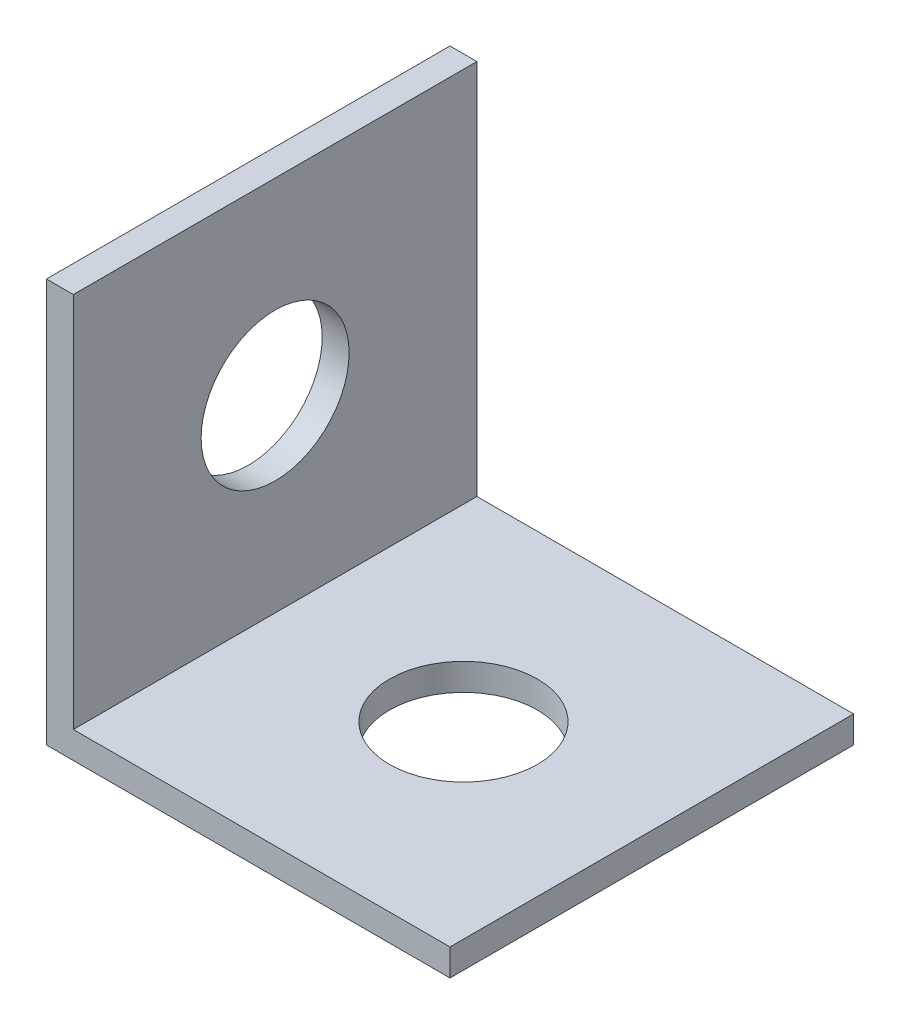
ISO-10303-21;
HEADER;
FILE_DESCRIPTION(('STEP AP214'),'2;1');
FILE_NAME('part.step','',(''),(''),'','','');
FILE_SCHEMA(('AUTOMOTIVE_DESIGN { 1 0 10303 214 1 1 1 1 }'));
ENDSEC;
DATA;
#1=APPLICATION_CONTEXT('core data for automotive mechanical design processes');
#2=APPLICATION_PROTOCOL_DEFINITION('international standard','automotive_design',2000,#1);
#3=PRODUCT_CONTEXT('',#1,'mechanical');
#4=PRODUCT('Part','Part','',(#3));
#5=PRODUCT_RELATED_PRODUCT_CATEGORY('part','',(#4));
#6=PRODUCT_DEFINITION_FORMATION('','',#4);
#7=PRODUCT_DEFINITION_CONTEXT('part definition',#1,'design');
#8=PRODUCT_DEFINITION('design','',#6,#7);
#9=PRODUCT_DEFINITION_SHAPE('','',#8);
#10=(LENGTH_UNIT() NAMED_UNIT(*) SI_UNIT(.MILLI.,.METRE.));
#11=(NAMED_UNIT(*) PLANE_ANGLE_UNIT() SI_UNIT($,.RADIAN.));
#12=(NAMED_UNIT(*) SI_UNIT($,.STERADIAN.) SOLID_ANGLE_UNIT());
#13=UNCERTAINTY_MEASURE_WITH_UNIT(LENGTH_MEASURE(1.E-05),#10,'distance_accuracy_value','');
#14=(GEOMETRIC_REPRESENTATION_CONTEXT(3) GLOBAL_UNCERTAINTY_ASSIGNED_CONTEXT((#13)) GLOBAL_UNIT_ASSIGNED_CONTEXT((#10,
#11,#12)) REPRESENTATION_CONTEXT('',''));
#15=CARTESIAN_POINT('',(0.,0.,0.));
#16=DIRECTION('',(0.,0.,1.));
#17=DIRECTION('',(1.,0.,0.));
#18=AXIS2_PLACEMENT_3D('',#15,#16,#17);
#19=CARTESIAN_POINT('',(15.,0.,15.));
#20=DIRECTION('',(0.,1.,0.));
#21=DIRECTION('',(-1.,0.,0.));
#22=AXIS2_PLACEMENT_3D('',#19,#20,#21);
#23=PLANE('',#22);
#24=CARTESIAN_POINT('',(8.,0.,7.5));
#25=DIRECTION('',(0.,-1.,0.));
#26=DIRECTION('',(1.,0.,0.));
#27=AXIS2_PLACEMENT_3D('',#24,#25,#26);
#28=CIRCLE('',#27,2.75);
#29=CARTESIAN_POINT('',(10.75,0.,7.5));
#30=VERTEX_POINT('',#29);
#31=EDGE_CURVE('E162',#30,#30,#28,.T.);
#32=ORIENTED_EDGE('',*,*,#31,.F.);
#33=EDGE_LOOP('',(#32));
#34=FACE_BOUND('',#33,.T.);
#35=DIRECTION('',(1.,0.,0.));
#36=VECTOR('',#35,1.);
#37=CARTESIAN_POINT('',(15.,0.,0.));
#38=LINE('',#37,#36);
#39=CARTESIAN_POINT('',(0.,0.,0.));
#40=VERTEX_POINT('',#39);
#41=CARTESIAN_POINT('',(15.,0.,0.));
#42=VERTEX_POINT('',#41);
#43=EDGE_CURVE('E118',#40,#42,#38,.T.);
#44=ORIENTED_EDGE('',*,*,#43,.T.);
#45=DIRECTION('',(0.,0.,-1.));
#46=VECTOR('',#45,1.);
#47=CARTESIAN_POINT('',(15.,0.,15.));
#48=LINE('',#47,#46);
#49=CARTESIAN_POINT('',(15.,0.,15.));
#50=VERTEX_POINT('',#49);
#51=EDGE_CURVE('E11',#50,#42,#48,.T.);
#52=ORIENTED_EDGE('',*,*,#51,.F.);
#53=DIRECTION('',(1.,0.,0.));
#54=VECTOR('',#53,1.);
#55=CARTESIAN_POINT('',(15.,0.,15.));
#56=LINE('',#55,#54);
#57=CARTESIAN_POINT('',(0.,0.,15.));
#58=VERTEX_POINT('',#57);
#59=EDGE_CURVE('E128',#58,#50,#56,.T.);
#60=ORIENTED_EDGE('',*,*,#59,.F.);
#61=DIRECTION('',(0.,0.,-1.));
#62=VECTOR('',#61,1.);
#63=CARTESIAN_POINT('',(0.,0.,15.));
#64=LINE('',#63,#62);
#65=EDGE_CURVE('E114',#58,#40,#64,.T.);
#66=ORIENTED_EDGE('',*,*,#65,.T.);
#67=EDGE_LOOP('',(#44,#52,#60,#66));
#68=FACE_BOUND('',#67,.T.);
#69=ADVANCED_FACE('F33',(#34,#68),#23,.F.);
#70=CARTESIAN_POINT('',(15.,1.,15.));
#71=DIRECTION('',(-1.,0.,0.));
#72=DIRECTION('',(0.,0.,1.));
#73=AXIS2_PLACEMENT_3D('',#70,#71,#72);
#74=PLANE('',#73);
#75=DIRECTION('',(0.,1.,0.));
#76=VECTOR('',#75,1.);
#77=CARTESIAN_POINT('',(15.,1.,0.));
#78=LINE('',#77,#76);
#79=CARTESIAN_POINT('',(15.,1.,0.));
#80=VERTEX_POINT('',#79);
#81=EDGE_CURVE('E121',#42,#80,#78,.T.);
#82=ORIENTED_EDGE('',*,*,#81,.T.);
#83=DIRECTION('',(0.,0.,-1.));
#84=VECTOR('',#83,1.);
#85=CARTESIAN_POINT('',(15.,1.,15.));
#86=LINE('',#85,#84);
#87=CARTESIAN_POINT('',(15.,1.,15.));
#88=VERTEX_POINT('',#87);
#89=EDGE_CURVE('E42',#88,#80,#86,.T.);
#90=ORIENTED_EDGE('',*,*,#89,.F.);
#91=DIRECTION('',(0.,1.,0.));
#92=VECTOR('',#91,1.);
#93=CARTESIAN_POINT('',(15.,1.,15.));
#94=LINE('',#93,#92);
#95=EDGE_CURVE('E87',#50,#88,#94,.T.);
#96=ORIENTED_EDGE('',*,*,#95,.F.);
#97=ORIENTED_EDGE('',*,*,#51,.T.);
#98=EDGE_LOOP('',(#82,#90,#96,#97));
#99=FACE_BOUND('',#98,.T.);
#100=ADVANCED_FACE('F155',(#99),#74,.F.);
#101=CARTESIAN_POINT('',(1.,1.,15.));
#102=DIRECTION('',(0.,-1.,0.));
#103=DIRECTION('',(1.,0.,0.));
#104=AXIS2_PLACEMENT_3D('',#101,#102,#103);
#105=PLANE('',#104);
#106=CARTESIAN_POINT('',(8.,1.,7.5));
#107=DIRECTION('',(0.,-1.,0.));
#108=DIRECTION('',(1.,0.,0.));
#109=AXIS2_PLACEMENT_3D('',#106,#107,#108);
#110=CIRCLE('',#109,2.75);
#111=CARTESIAN_POINT('',(10.75,1.,7.5));
#112=VERTEX_POINT('',#111);
#113=EDGE_CURVE('E36',#112,#112,#110,.T.);
#114=ORIENTED_EDGE('',*,*,#113,.T.);
#115=EDGE_LOOP('',(#114));
#116=FACE_BOUND('',#115,.T.);
#117=DIRECTION('',(-1.,0.,0.));
#118=VECTOR('',#117,1.);
#119=CARTESIAN_POINT('',(1.,1.,0.));
#120=LINE('',#119,#118);
#121=CARTESIAN_POINT('',(1.,1.,0.));
#122=VERTEX_POINT('',#121);
#123=EDGE_CURVE('E123',#80,#122,#120,.T.);
#124=ORIENTED_EDGE('',*,*,#123,.T.);
#125=DIRECTION('',(0.,0.,-1.));
#126=VECTOR('',#125,1.);
#127=CARTESIAN_POINT('',(1.,1.,15.));
#128=LINE('',#127,#126);
#129=CARTESIAN_POINT('',(1.,1.,15.));
#130=VERTEX_POINT('',#129);
#131=EDGE_CURVE('E109',#130,#122,#128,.T.);
#132=ORIENTED_EDGE('',*,*,#131,.F.);
#133=DIRECTION('',(-1.,0.,0.));
#134=VECTOR('',#133,1.);
#135=CARTESIAN_POINT('',(1.,1.,15.));
#136=LINE('',#135,#134);
#137=EDGE_CURVE('E100',#88,#130,#136,.T.);
#138=ORIENTED_EDGE('',*,*,#137,.F.);
#139=ORIENTED_EDGE('',*,*,#89,.T.);
#140=EDGE_LOOP('',(#124,#132,#138,#139));
#141=FACE_BOUND('',#140,.T.);
#142=ADVANCED_FACE('F135',(#116,#141),#105,.F.);
#143=CARTESIAN_POINT('',(0.999999999999997,15.,15.));
#144=DIRECTION('',(-1.,0.,0.));
#145=DIRECTION('',(0.,-1.,0.));
#146=AXIS2_PLACEMENT_3D('',#143,#144,#145);
#147=PLANE('',#146);
#148=CARTESIAN_POINT('',(0.999999999999999,8.,7.5));
#149=DIRECTION('',(1.,0.,0.));
#150=DIRECTION('',(0.,1.,0.));
#151=AXIS2_PLACEMENT_3D('',#148,#149,#150);
#152=CIRCLE('',#151,2.75);
#153=CARTESIAN_POINT('',(0.999999999999998,10.75,7.5));
#154=VERTEX_POINT('',#153);
#155=EDGE_CURVE('E167',#154,#154,#152,.T.);
#156=ORIENTED_EDGE('',*,*,#155,.F.);
#157=EDGE_LOOP('',(#156));
#158=FACE_BOUND('',#157,.T.);
#159=DIRECTION('',(0.,1.,0.));
#160=VECTOR('',#159,1.);
#161=CARTESIAN_POINT('',(0.999999999999997,15.,0.));
#162=LINE('',#161,#160);
#163=CARTESIAN_POINT('',(0.999999999999997,15.,0.));
#164=VERTEX_POINT('',#163);
#165=EDGE_CURVE('E108',#122,#164,#162,.T.);
#166=ORIENTED_EDGE('',*,*,#165,.T.);
#167=DIRECTION('',(0.,0.,-1.));
#168=VECTOR('',#167,1.);
#169=CARTESIAN_POINT('',(0.999999999999997,15.,15.));
#170=LINE('',#169,#168);
#171=CARTESIAN_POINT('',(0.999999999999997,15.,15.));
#172=VERTEX_POINT('',#171);
#173=EDGE_CURVE('E105',#172,#164,#170,.T.);
#174=ORIENTED_EDGE('',*,*,#173,.F.);
#175=DIRECTION('',(0.,1.,0.));
#176=VECTOR('',#175,1.);
#177=CARTESIAN_POINT('',(0.999999999999997,15.,15.));
#178=LINE('',#177,#176);
#179=EDGE_CURVE('E94',#130,#172,#178,.T.);
#180=ORIENTED_EDGE('',*,*,#179,.F.);
#181=ORIENTED_EDGE('',*,*,#131,.T.);
#182=EDGE_LOOP('',(#166,#174,#180,#181));
#183=FACE_BOUND('',#182,.T.);
#184=ADVANCED_FACE('F106',(#158,#183),#147,.F.);
#185=CARTESIAN_POINT('',(0.,15.,15.));
#186=DIRECTION('',(0.,-1.,0.));
#187=DIRECTION('',(0.,0.,-1.));
#188=AXIS2_PLACEMENT_3D('',#185,#186,#187);
#189=PLANE('',#188);
#190=DIRECTION('',(-1.,0.,0.));
#191=VECTOR('',#190,1.);
#192=CARTESIAN_POINT('',(0.,15.,0.));
#193=LINE('',#192,#191);
#194=CARTESIAN_POINT('',(0.,15.,0.));
#195=VERTEX_POINT('',#194);
#196=EDGE_CURVE('E73',#164,#195,#193,.T.);
#197=ORIENTED_EDGE('',*,*,#196,.T.);
#198=DIRECTION('',(0.,0.,-1.));
#199=VECTOR('',#198,1.);
#200=CARTESIAN_POINT('',(0.,15.,15.));
#201=LINE('',#200,#199);
#202=CARTESIAN_POINT('',(0.,15.,15.));
#203=VERTEX_POINT('',#202);
#204=EDGE_CURVE('E110',#203,#195,#201,.T.);
#205=ORIENTED_EDGE('',*,*,#204,.F.);
#206=DIRECTION('',(-1.,0.,0.));
#207=VECTOR('',#206,1.);
#208=CARTESIAN_POINT('',(0.,15.,15.));
#209=LINE('',#208,#207);
#210=EDGE_CURVE('E98',#172,#203,#209,.T.);
#211=ORIENTED_EDGE('',*,*,#210,.F.);
#212=ORIENTED_EDGE('',*,*,#173,.T.);
#213=EDGE_LOOP('',(#197,#205,#211,#212));
#214=FACE_BOUND('',#213,.T.);
#215=ADVANCED_FACE('F112',(#214),#189,.F.);
#216=CARTESIAN_POINT('',(0.,0.,15.));
#217=DIRECTION('',(1.,0.,0.));
#218=DIRECTION('',(0.,1.,0.));
#219=AXIS2_PLACEMENT_3D('',#216,#217,#218);
#220=PLANE('',#219);
#221=CARTESIAN_POINT('',(0.,8.,7.5));
#222=DIRECTION('',(1.,0.,0.));
#223=DIRECTION('',(0.,1.,0.));
#224=AXIS2_PLACEMENT_3D('',#221,#222,#223);
#225=CIRCLE('',#224,2.75);
#226=CARTESIAN_POINT('',(0.,10.75,7.5));
#227=VERTEX_POINT('',#226);
#228=EDGE_CURVE('E164',#227,#227,#225,.T.);
#229=ORIENTED_EDGE('',*,*,#228,.T.);
#230=EDGE_LOOP('',(#229));
#231=FACE_BOUND('',#230,.T.);
#232=DIRECTION('',(0.,-1.,0.));
#233=VECTOR('',#232,1.);
#234=CARTESIAN_POINT('',(0.,0.,0.));
#235=LINE('',#234,#233);
#236=EDGE_CURVE('E79',#195,#40,#235,.T.);
#237=ORIENTED_EDGE('',*,*,#236,.T.);
#238=ORIENTED_EDGE('',*,*,#65,.F.);
#239=DIRECTION('',(0.,-1.,0.));
#240=VECTOR('',#239,1.);
#241=CARTESIAN_POINT('',(0.,0.,15.));
#242=LINE('',#241,#240);
#243=EDGE_CURVE('E50',#203,#58,#242,.T.);
#244=ORIENTED_EDGE('',*,*,#243,.F.);
#245=ORIENTED_EDGE('',*,*,#204,.T.);
#246=EDGE_LOOP('',(#237,#238,#244,#245));
#247=FACE_BOUND('',#246,.T.);
#248=ADVANCED_FACE('F142',(#231,#247),#220,.F.);
#249=CARTESIAN_POINT('',(0.,0.,15.));
#250=DIRECTION('',(0.,0.,-1.));
#251=DIRECTION('',(-1.,0.,0.));
#252=AXIS2_PLACEMENT_3D('',#249,#250,#251);
#253=PLANE('',#252);
#254=ORIENTED_EDGE('',*,*,#59,.T.);
#255=ORIENTED_EDGE('',*,*,#95,.T.);
#256=ORIENTED_EDGE('',*,*,#137,.T.);
#257=ORIENTED_EDGE('',*,*,#179,.T.);
#258=ORIENTED_EDGE('',*,*,#210,.T.);
#259=ORIENTED_EDGE('',*,*,#243,.T.);
#260=EDGE_LOOP('',(#254,#255,#256,#257,#258,#259));
#261=FACE_BOUND('',#260,.T.);
#262=ADVANCED_FACE('F96',(#261),#253,.F.);
#263=CARTESIAN_POINT('',(0.,0.,0.));
#264=DIRECTION('',(0.,0.,-1.));
#265=DIRECTION('',(-1.,0.,0.));
#266=AXIS2_PLACEMENT_3D('',#263,#264,#265);
#267=PLANE('',#266);
#268=ORIENTED_EDGE('',*,*,#43,.F.);
#269=ORIENTED_EDGE('',*,*,#236,.F.);
#270=ORIENTED_EDGE('',*,*,#196,.F.);
#271=ORIENTED_EDGE('',*,*,#165,.F.);
#272=ORIENTED_EDGE('',*,*,#123,.F.);
#273=ORIENTED_EDGE('',*,*,#81,.F.);
#274=EDGE_LOOP('',(#268,#269,#270,#271,#272,#273));
#275=FACE_BOUND('',#274,.T.);
#276=ADVANCED_FACE('F138',(#275),#267,.T.);
#277=CARTESIAN_POINT('',(8.,19.05,7.5));
#278=DIRECTION('',(0.,-1.,0.));
#279=DIRECTION('',(1.,0.,0.));
#280=AXIS2_PLACEMENT_3D('',#277,#278,#279);
#281=CYLINDRICAL_SURFACE('',#280,2.75);
#282=CARTESIAN_POINT('',(10.75,0.,7.5));
#283=CARTESIAN_POINT('',(10.75,0.0104166666666667,7.5));
#284=CARTESIAN_POINT('',(10.75,0.0208333333333333,7.5));
#285=CARTESIAN_POINT('',(10.75,0.0416666666666667,7.5));
#286=CARTESIAN_POINT('',(10.75,0.0520833333333334,7.5));
#287=CARTESIAN_POINT('',(10.75,0.0729166666666667,7.5));
#288=CARTESIAN_POINT('',(10.75,0.0833333333333334,7.5));
#289=CARTESIAN_POINT('',(10.75,0.104166666666667,7.5));
#290=CARTESIAN_POINT('',(10.75,0.114583333333333,7.5));
#291=CARTESIAN_POINT('',(10.75,0.135416666666667,7.5));
#292=CARTESIAN_POINT('',(10.75,0.145833333333333,7.5));
#293=CARTESIAN_POINT('',(10.75,0.166666666666667,7.5));
#294=CARTESIAN_POINT('',(10.75,0.177083333333333,7.5));
#295=CARTESIAN_POINT('',(10.75,0.197916666666667,7.5));
#296=CARTESIAN_POINT('',(10.75,0.208333333333334,7.5));
#297=CARTESIAN_POINT('',(10.75,0.229166666666667,7.5));
#298=CARTESIAN_POINT('',(10.75,0.239583333333334,7.5));
#299=CARTESIAN_POINT('',(10.75,0.260416666666667,7.5));
#300=CARTESIAN_POINT('',(10.75,0.270833333333334,7.5));
#301=CARTESIAN_POINT('',(10.75,0.291666666666667,7.5));
#302=CARTESIAN_POINT('',(10.75,0.302083333333334,7.5));
#303=CARTESIAN_POINT('',(10.75,0.322916666666667,7.5));
#304=CARTESIAN_POINT('',(10.75,0.333333333333334,7.5));
#305=CARTESIAN_POINT('',(10.75,0.354166666666667,7.5));
#306=CARTESIAN_POINT('',(10.75,0.364583333333334,7.5));
#307=CARTESIAN_POINT('',(10.75,0.385416666666667,7.5));
#308=CARTESIAN_POINT('',(10.75,0.395833333333334,7.5));
#309=CARTESIAN_POINT('',(10.75,0.416666666666667,7.5));
#310=CARTESIAN_POINT('',(10.75,0.427083333333334,7.5));
#311=CARTESIAN_POINT('',(10.75,0.447916666666667,7.5));
#312=CARTESIAN_POINT('',(10.75,0.458333333333334,7.5));
#313=CARTESIAN_POINT('',(10.75,0.479166666666667,7.5));
#314=CARTESIAN_POINT('',(10.75,0.489583333333334,7.5));
#315=CARTESIAN_POINT('',(10.75,0.510416666666667,7.5));
#316=CARTESIAN_POINT('',(10.75,0.520833333333334,7.5));
#317=CARTESIAN_POINT('',(10.75,0.541666666666667,7.5));
#318=CARTESIAN_POINT('',(10.75,0.552083333333334,7.5));
#319=CARTESIAN_POINT('',(10.75,0.572916666666667,7.5));
#320=CARTESIAN_POINT('',(10.75,0.583333333333334,7.5));
#321=CARTESIAN_POINT('',(10.75,0.604166666666667,7.5));
#322=CARTESIAN_POINT('',(10.75,0.614583333333334,7.5));
#323=CARTESIAN_POINT('',(10.75,0.635416666666667,7.5));
#324=CARTESIAN_POINT('',(10.75,0.645833333333334,7.5));
#325=CARTESIAN_POINT('',(10.75,0.666666666666667,7.5));
#326=CARTESIAN_POINT('',(10.75,0.677083333333334,7.5));
#327=CARTESIAN_POINT('',(10.75,0.697916666666667,7.5));
#328=CARTESIAN_POINT('',(10.75,0.708333333333334,7.5));
#329=CARTESIAN_POINT('',(10.75,0.729166666666667,7.5));
#330=CARTESIAN_POINT('',(10.75,0.739583333333334,7.5));
#331=CARTESIAN_POINT('',(10.75,0.760416666666667,7.5));
#332=CARTESIAN_POINT('',(10.75,0.770833333333334,7.5));
#333=CARTESIAN_POINT('',(10.75,0.791666666666667,7.5));
#334=CARTESIAN_POINT('',(10.75,0.802083333333334,7.5));
#335=CARTESIAN_POINT('',(10.75,0.822916666666667,7.5));
#336=CARTESIAN_POINT('',(10.75,0.833333333333334,7.5));
#337=CARTESIAN_POINT('',(10.75,0.854166666666667,7.5));
#338=CARTESIAN_POINT('',(10.75,0.864583333333334,7.5));
#339=CARTESIAN_POINT('',(10.75,0.885416666666668,7.5));
#340=CARTESIAN_POINT('',(10.75,0.895833333333334,7.5));
#341=CARTESIAN_POINT('',(10.75,0.916666666666668,7.5));
#342=CARTESIAN_POINT('',(10.75,0.927083333333334,7.5));
#343=CARTESIAN_POINT('',(10.75,0.947916666666668,7.5));
#344=CARTESIAN_POINT('',(10.75,0.958333333333334,7.5));
#345=CARTESIAN_POINT('',(10.75,0.979166666666668,7.5));
#346=CARTESIAN_POINT('',(10.75,0.989583333333334,7.5));
#347=CARTESIAN_POINT('',(10.75,1.,7.5));
#348=B_SPLINE_CURVE_WITH_KNOTS('',3,(#282,#283,#284,#285,#286,#287,#288,#289,#290,#291,#292,
#293,#294,#295,#296,#297,#298,#299,#300,#301,#302,#303,#304,#305,#306,#307,#308,#309,#310,#311,
#312,#313,#314,#315,#316,#317,#318,#319,#320,#321,#322,#323,#324,#325,#326,#327,#328,#329,#330,
#331,#332,#333,#334,#335,#336,#337,#338,#339,#340,#341,#342,#343,#344,#345,#346,#347),
.UNSPECIFIED.,.F.,.F.,(4,2,2,2,2,2,2,2,2,2,2,2,2,2,2,2,2,2,2,2,2,2,2,2,2,2,2,2,2,2,2,2,4),(0.,
0.03125,0.0625000000000001,0.0937500000000001,0.125,0.15625,0.1875,0.21875,0.25,0.28125,0.3125,
0.34375,0.375,0.40625,0.4375,0.46875,0.5,0.53125,0.5625,0.593750000000001,0.625000000000001,
0.656250000000001,0.687500000000001,0.718750000000001,0.750000000000001,0.781250000000001,
0.812500000000001,0.843750000000001,0.875000000000001,0.906250000000001,0.937500000000001,
0.968750000000001,1.),.UNSPECIFIED.);
#349=EDGE_CURVE('BSEAM188',#30,#112,#348,.T.);
#350=ORIENTED_EDGE('',*,*,#31,.T.);
#351=ORIENTED_EDGE('',*,*,#113,.F.);
#352=ORIENTED_EDGE('',*,*,#349,.T.);
#353=ORIENTED_EDGE('',*,*,#349,.F.);
#354=EDGE_LOOP('',(#350,#352,#351,#353));
#355=FACE_BOUND('',#354,.T.);
#356=ADVANCED_FACE('F188',(#355),#281,.F.);
#357=CARTESIAN_POINT('',(0.,8.,7.5));
#358=DIRECTION('',(1.,0.,0.));
#359=DIRECTION('',(0.,1.,0.));
#360=AXIS2_PLACEMENT_3D('',#357,#358,#359);
#361=CYLINDRICAL_SURFACE('',#360,2.75);
#362=ORIENTED_EDGE('',*,*,#228,.F.);
#363=EDGE_LOOP('',(#362));
#364=FACE_BOUND('',#363,.T.);
#365=ORIENTED_EDGE('',*,*,#155,.T.);
#366=EDGE_LOOP('',(#365));
#367=FACE_BOUND('',#366,.T.);
#368=ADVANCED_FACE('F175',(#364,#367),#361,.F.);
#369=CLOSED_SHELL('',(#69,#100,#142,#184,#215,#248,#262,#276,#356,#368));
#370=MANIFOLD_SOLID_BREP('B2',#369);
#371=ADVANCED_BREP_SHAPE_REPRESENTATION('',(#18,#370),#14);
#372=SHAPE_DEFINITION_REPRESENTATION(#9,#371);
ENDSEC;
END-ISO-10303-21;
